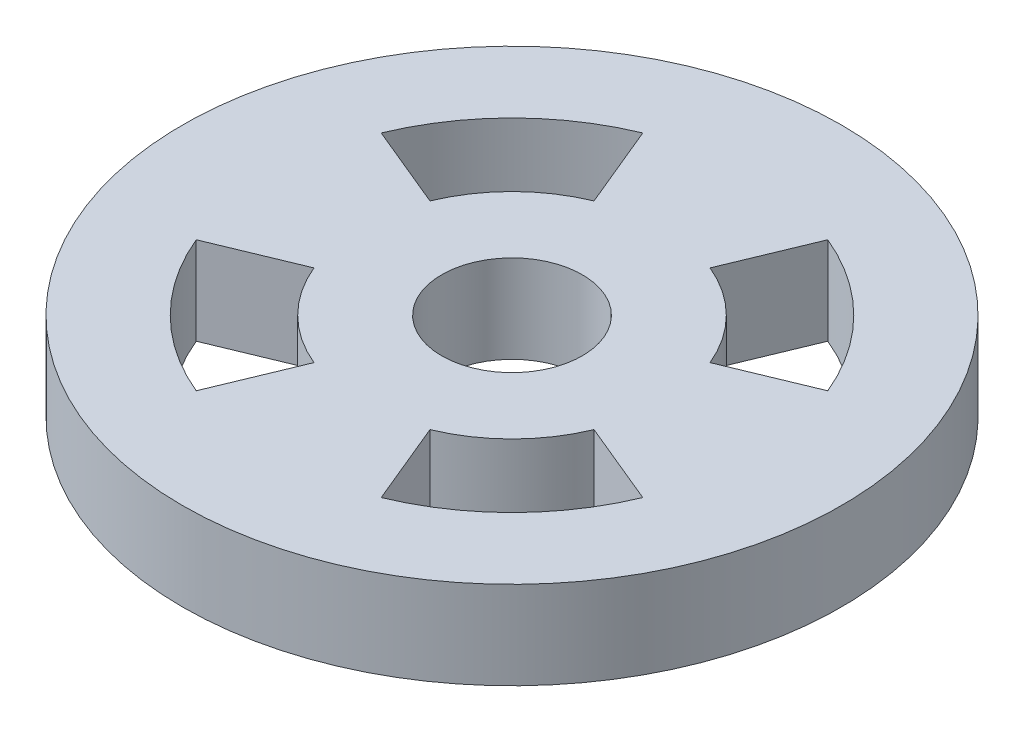
ISO-10303-21;
HEADER;
FILE_DESCRIPTION(('STEP AP214'),'2;1');
FILE_NAME('part.step','',(''),(''),'','','');
FILE_SCHEMA(('AUTOMOTIVE_DESIGN { 1 0 10303 214 1 1 1 1 }'));
ENDSEC;
DATA;
#1=APPLICATION_CONTEXT('core data for automotive mechanical design processes');
#2=APPLICATION_PROTOCOL_DEFINITION('international standard','automotive_design',2000,#1);
#3=PRODUCT_CONTEXT('',#1,'mechanical');
#4=PRODUCT('Part','Part','',(#3));
#5=PRODUCT_RELATED_PRODUCT_CATEGORY('part','',(#4));
#6=PRODUCT_DEFINITION_FORMATION('','',#4);
#7=PRODUCT_DEFINITION_CONTEXT('part definition',#1,'design');
#8=PRODUCT_DEFINITION('design','',#6,#7);
#9=PRODUCT_DEFINITION_SHAPE('','',#8);
#10=(LENGTH_UNIT() NAMED_UNIT(*) SI_UNIT(.MILLI.,.METRE.));
#11=(NAMED_UNIT(*) PLANE_ANGLE_UNIT() SI_UNIT($,.RADIAN.));
#12=(NAMED_UNIT(*) SI_UNIT($,.STERADIAN.) SOLID_ANGLE_UNIT());
#13=UNCERTAINTY_MEASURE_WITH_UNIT(LENGTH_MEASURE(1.E-05),#10,'distance_accuracy_value','');
#14=(GEOMETRIC_REPRESENTATION_CONTEXT(3) GLOBAL_UNCERTAINTY_ASSIGNED_CONTEXT((#13)) GLOBAL_UNIT_ASSIGNED_CONTEXT((#10,
#11,#12)) REPRESENTATION_CONTEXT('',''));
#15=CARTESIAN_POINT('',(0.,0.,0.));
#16=DIRECTION('',(0.,0.,1.));
#17=DIRECTION('',(1.,0.,0.));
#18=AXIS2_PLACEMENT_3D('',#15,#16,#17);
#19=CARTESIAN_POINT('',(0.,2.,0.));
#20=DIRECTION('',(0.,1.,0.));
#21=DIRECTION('',(0.,0.,1.));
#22=AXIS2_PLACEMENT_3D('',#19,#20,#21);
#23=PLANE('',#22);
#24=CARTESIAN_POINT('',(0.,2.,0.));
#25=DIRECTION('',(0.,1.,0.));
#26=DIRECTION('',(0.,0.,1.));
#27=AXIS2_PLACEMENT_3D('',#24,#25,#26);
#28=CIRCLE('',#27,7.5);
#29=CARTESIAN_POINT('',(0.,2.,7.5));
#30=VERTEX_POINT('',#29);
#31=EDGE_CURVE('E11',#30,#30,#28,.T.);
#32=ORIENTED_EDGE('',*,*,#31,.T.);
#33=EDGE_LOOP('',(#32));
#34=FACE_BOUND('',#33,.T.);
#35=CARTESIAN_POINT('',(0.,2.,0.));
#36=DIRECTION('',(0.,1.,0.));
#37=DIRECTION('',(0.,0.,1.));
#38=AXIS2_PLACEMENT_3D('',#35,#36,#37);
#39=CIRCLE('',#38,1.6);
#40=CARTESIAN_POINT('',(0.,2.,1.6));
#41=VERTEX_POINT('',#40);
#42=EDGE_CURVE('E275',#41,#41,#39,.T.);
#43=ORIENTED_EDGE('',*,*,#42,.F.);
#44=EDGE_LOOP('',(#43));
#45=FACE_BOUND('',#44,.T.);
#46=DIRECTION('',(0.923879532511286,0.,0.382683432365091));
#47=VECTOR('',#46,1.);
#48=CARTESIAN_POINT('',(-3.18654053840399,2.,-1.3199083080586));
#49=LINE('',#48,#47);
#50=CARTESIAN_POINT('',(-5.08133742881208,2.,-2.10475887800799));
#51=VERTEX_POINT('',#50);
#52=CARTESIAN_POINT('',(-3.18654053840399,2.,-1.3199083080586));
#53=VERTEX_POINT('',#52);
#54=EDGE_CURVE('E246',#51,#53,#49,.T.);
#55=ORIENTED_EDGE('',*,*,#54,.F.);
#56=CARTESIAN_POINT('',(0.,2.,0.));
#57=DIRECTION('',(0.,1.,0.));
#58=DIRECTION('',(0.,0.,1.));
#59=AXIS2_PLACEMENT_3D('',#56,#57,#58);
#60=CIRCLE('',#59,5.5);
#61=CARTESIAN_POINT('',(-2.104758878008,2.,-5.08133742881208));
#62=VERTEX_POINT('',#61);
#63=EDGE_CURVE('E244',#62,#51,#60,.T.);
#64=ORIENTED_EDGE('',*,*,#63,.F.);
#65=DIRECTION('',(-0.38268343236509,0.,-0.923879532511287));
#66=VECTOR('',#65,1.);
#67=CARTESIAN_POINT('',(-1.3199083080586,2.,-3.18654053840399));
#68=LINE('',#67,#66);
#69=CARTESIAN_POINT('',(-1.3199083080586,2.,-3.18654053840399));
#70=VERTEX_POINT('',#69);
#71=EDGE_CURVE('E252',#70,#62,#68,.T.);
#72=ORIENTED_EDGE('',*,*,#71,.F.);
#73=CARTESIAN_POINT('',(0.,2.,0.));
#74=DIRECTION('',(0.,-1.,0.));
#75=DIRECTION('',(0.,0.,1.));
#76=AXIS2_PLACEMENT_3D('',#73,#74,#75);
#77=CIRCLE('',#76,3.44908662468401);
#78=EDGE_CURVE('E249',#53,#70,#77,.T.);
#79=ORIENTED_EDGE('',*,*,#78,.F.);
#80=EDGE_LOOP('',(#55,#64,#72,#79));
#81=FACE_BOUND('',#80,.T.);
#82=DIRECTION('',(-0.38268343236509,0.,0.923879532511287));
#83=VECTOR('',#82,1.);
#84=CARTESIAN_POINT('',(1.3199083080586,2.,-3.18654053840399));
#85=LINE('',#84,#83);
#86=CARTESIAN_POINT('',(2.104758878008,2.,-5.08133742881208));
#87=VERTEX_POINT('',#86);
#88=CARTESIAN_POINT('',(1.3199083080586,2.,-3.18654053840399));
#89=VERTEX_POINT('',#88);
#90=EDGE_CURVE('E215',#87,#89,#85,.T.);
#91=ORIENTED_EDGE('',*,*,#90,.F.);
#92=CARTESIAN_POINT('',(0.,2.,0.));
#93=DIRECTION('',(0.,1.,0.));
#94=DIRECTION('',(0.,0.,1.));
#95=AXIS2_PLACEMENT_3D('',#92,#93,#94);
#96=CIRCLE('',#95,5.5);
#97=CARTESIAN_POINT('',(5.08133742881208,2.,-2.104758878008));
#98=VERTEX_POINT('',#97);
#99=EDGE_CURVE('E213',#98,#87,#96,.T.);
#100=ORIENTED_EDGE('',*,*,#99,.F.);
#101=DIRECTION('',(0.923879532511287,0.,-0.38268343236509));
#102=VECTOR('',#101,1.);
#103=CARTESIAN_POINT('',(3.18654053840399,2.,-1.3199083080586));
#104=LINE('',#103,#102);
#105=CARTESIAN_POINT('',(3.18654053840399,2.,-1.3199083080586));
#106=VERTEX_POINT('',#105);
#107=EDGE_CURVE('E221',#106,#98,#104,.T.);
#108=ORIENTED_EDGE('',*,*,#107,.F.);
#109=CARTESIAN_POINT('',(0.,2.,0.));
#110=DIRECTION('',(0.,-1.,0.));
#111=DIRECTION('',(0.,0.,1.));
#112=AXIS2_PLACEMENT_3D('',#109,#110,#111);
#113=CIRCLE('',#112,3.44908662468401);
#114=EDGE_CURVE('E218',#89,#106,#113,.T.);
#115=ORIENTED_EDGE('',*,*,#114,.F.);
#116=EDGE_LOOP('',(#91,#100,#108,#115));
#117=FACE_BOUND('',#116,.T.);
#118=DIRECTION('',(-0.923879532511286,0.,-0.382683432365091));
#119=VECTOR('',#118,1.);
#120=CARTESIAN_POINT('',(3.18654053840399,2.,1.3199083080586));
#121=LINE('',#120,#119);
#122=CARTESIAN_POINT('',(5.08133742881208,2.,2.104758878008));
#123=VERTEX_POINT('',#122);
#124=CARTESIAN_POINT('',(3.18654053840399,2.,1.3199083080586));
#125=VERTEX_POINT('',#124);
#126=EDGE_CURVE('E184',#123,#125,#121,.T.);
#127=ORIENTED_EDGE('',*,*,#126,.F.);
#128=CARTESIAN_POINT('',(0.,2.,0.));
#129=DIRECTION('',(0.,1.,0.));
#130=DIRECTION('',(0.,0.,1.));
#131=AXIS2_PLACEMENT_3D('',#128,#129,#130);
#132=CIRCLE('',#131,5.5);
#133=CARTESIAN_POINT('',(2.104758878008,2.,5.08133742881208));
#134=VERTEX_POINT('',#133);
#135=EDGE_CURVE('E182',#134,#123,#132,.T.);
#136=ORIENTED_EDGE('',*,*,#135,.F.);
#137=DIRECTION('',(0.38268343236509,0.,0.923879532511287));
#138=VECTOR('',#137,1.);
#139=CARTESIAN_POINT('',(1.3199083080586,2.,3.18654053840399));
#140=LINE('',#139,#138);
#141=CARTESIAN_POINT('',(1.3199083080586,2.,3.18654053840399));
#142=VERTEX_POINT('',#141);
#143=EDGE_CURVE('E190',#142,#134,#140,.T.);
#144=ORIENTED_EDGE('',*,*,#143,.F.);
#145=CARTESIAN_POINT('',(0.,2.,0.));
#146=DIRECTION('',(0.,-1.,0.));
#147=DIRECTION('',(0.,0.,1.));
#148=AXIS2_PLACEMENT_3D('',#145,#146,#147);
#149=CIRCLE('',#148,3.44908662468401);
#150=EDGE_CURVE('E187',#125,#142,#149,.T.);
#151=ORIENTED_EDGE('',*,*,#150,.F.);
#152=EDGE_LOOP('',(#127,#136,#144,#151));
#153=FACE_BOUND('',#152,.T.);
#154=DIRECTION('',(0.382683432365091,0.,-0.923879532511286));
#155=VECTOR('',#154,1.);
#156=CARTESIAN_POINT('',(-1.3199083080586,2.,3.18654053840399));
#157=LINE('',#156,#155);
#158=CARTESIAN_POINT('',(-2.104758878008,2.,5.08133742881208));
#159=VERTEX_POINT('',#158);
#160=CARTESIAN_POINT('',(-1.3199083080586,2.,3.18654053840399));
#161=VERTEX_POINT('',#160);
#162=EDGE_CURVE('E154',#159,#161,#157,.T.);
#163=ORIENTED_EDGE('',*,*,#162,.F.);
#164=CARTESIAN_POINT('',(0.,2.,0.));
#165=DIRECTION('',(0.,1.,0.));
#166=DIRECTION('',(0.,0.,1.));
#167=AXIS2_PLACEMENT_3D('',#164,#165,#166);
#168=CIRCLE('',#167,5.5);
#169=CARTESIAN_POINT('',(-5.08133742881208,2.,2.104758878008));
#170=VERTEX_POINT('',#169);
#171=EDGE_CURVE('E146',#170,#159,#168,.T.);
#172=ORIENTED_EDGE('',*,*,#171,.F.);
#173=DIRECTION('',(-0.923879532511287,0.,0.38268343236509));
#174=VECTOR('',#173,1.);
#175=CARTESIAN_POINT('',(-3.18654053840399,2.,1.3199083080586));
#176=LINE('',#175,#174);
#177=CARTESIAN_POINT('',(-3.18654053840399,2.,1.3199083080586));
#178=VERTEX_POINT('',#177);
#179=EDGE_CURVE('E168',#178,#170,#176,.T.);
#180=ORIENTED_EDGE('',*,*,#179,.F.);
#181=CARTESIAN_POINT('',(0.,2.,0.));
#182=DIRECTION('',(0.,-1.,0.));
#183=DIRECTION('',(0.,0.,1.));
#184=AXIS2_PLACEMENT_3D('',#181,#182,#183);
#185=CIRCLE('',#184,3.44908662468401);
#186=EDGE_CURVE('E166',#161,#178,#185,.T.);
#187=ORIENTED_EDGE('',*,*,#186,.F.);
#188=EDGE_LOOP('',(#163,#172,#180,#187));
#189=FACE_BOUND('',#188,.T.);
#190=ADVANCED_FACE('F33',(#34,#45,#81,#117,#153,#189),#23,.T.);
#191=CARTESIAN_POINT('',(0.,0.,0.));
#192=DIRECTION('',(0.,1.,0.));
#193=DIRECTION('',(0.,0.,1.));
#194=AXIS2_PLACEMENT_3D('',#191,#192,#193);
#195=PLANE('',#194);
#196=CARTESIAN_POINT('',(0.,0.,0.));
#197=DIRECTION('',(0.,1.,0.));
#198=DIRECTION('',(0.,0.,1.));
#199=AXIS2_PLACEMENT_3D('',#196,#197,#198);
#200=CIRCLE('',#199,5.5);
#201=CARTESIAN_POINT('',(2.104758878008,0.,5.08133742881208));
#202=VERTEX_POINT('',#201);
#203=CARTESIAN_POINT('',(5.08133742881208,0.,2.104758878008));
#204=VERTEX_POINT('',#203);
#205=EDGE_CURVE('E162',#202,#204,#200,.T.);
#206=ORIENTED_EDGE('',*,*,#205,.T.);
#207=DIRECTION('',(-0.923879532511286,0.,-0.382683432365091));
#208=VECTOR('',#207,1.);
#209=CARTESIAN_POINT('',(3.18654053840399,0.,1.3199083080586));
#210=LINE('',#209,#208);
#211=CARTESIAN_POINT('',(3.18654053840399,0.,1.3199083080586));
#212=VERTEX_POINT('',#211);
#213=EDGE_CURVE('E195',#204,#212,#210,.T.);
#214=ORIENTED_EDGE('',*,*,#213,.T.);
#215=CARTESIAN_POINT('',(0.,0.,0.));
#216=DIRECTION('',(0.,-1.,0.));
#217=DIRECTION('',(0.,0.,1.));
#218=AXIS2_PLACEMENT_3D('',#215,#216,#217);
#219=CIRCLE('',#218,3.44908662468401);
#220=CARTESIAN_POINT('',(1.3199083080586,0.,3.18654053840399));
#221=VERTEX_POINT('',#220);
#222=EDGE_CURVE('E198',#212,#221,#219,.T.);
#223=ORIENTED_EDGE('',*,*,#222,.T.);
#224=DIRECTION('',(0.38268343236509,0.,0.923879532511287));
#225=VECTOR('',#224,1.);
#226=CARTESIAN_POINT('',(1.3199083080586,0.,3.18654053840399));
#227=LINE('',#226,#225);
#228=EDGE_CURVE('E185',#221,#202,#227,.T.);
#229=ORIENTED_EDGE('',*,*,#228,.T.);
#230=EDGE_LOOP('',(#206,#214,#223,#229));
#231=FACE_BOUND('',#230,.T.);
#232=CARTESIAN_POINT('',(0.,0.,0.));
#233=DIRECTION('',(0.,1.,0.));
#234=DIRECTION('',(0.,0.,1.));
#235=AXIS2_PLACEMENT_3D('',#232,#233,#234);
#236=CIRCLE('',#235,5.5);
#237=CARTESIAN_POINT('',(-2.104758878008,0.,-5.08133742881208));
#238=VERTEX_POINT('',#237);
#239=CARTESIAN_POINT('',(-5.08133742881208,0.,-2.10475887800799));
#240=VERTEX_POINT('',#239);
#241=EDGE_CURVE('E243',#238,#240,#236,.T.);
#242=ORIENTED_EDGE('',*,*,#241,.T.);
#243=DIRECTION('',(0.923879532511286,0.,0.382683432365091));
#244=VECTOR('',#243,1.);
#245=CARTESIAN_POINT('',(-3.18654053840399,0.,-1.3199083080586));
#246=LINE('',#245,#244);
#247=CARTESIAN_POINT('',(-3.18654053840399,0.,-1.3199083080586));
#248=VERTEX_POINT('',#247);
#249=EDGE_CURVE('E257',#240,#248,#246,.T.);
#250=ORIENTED_EDGE('',*,*,#249,.T.);
#251=CARTESIAN_POINT('',(0.,0.,0.));
#252=DIRECTION('',(0.,-1.,0.));
#253=DIRECTION('',(0.,0.,1.));
#254=AXIS2_PLACEMENT_3D('',#251,#252,#253);
#255=CIRCLE('',#254,3.44908662468401);
#256=CARTESIAN_POINT('',(-1.3199083080586,0.,-3.18654053840399));
#257=VERTEX_POINT('',#256);
#258=EDGE_CURVE('E260',#248,#257,#255,.T.);
#259=ORIENTED_EDGE('',*,*,#258,.T.);
#260=DIRECTION('',(-0.38268343236509,0.,-0.923879532511287));
#261=VECTOR('',#260,1.);
#262=CARTESIAN_POINT('',(-1.3199083080586,0.,-3.18654053840399));
#263=LINE('',#262,#261);
#264=EDGE_CURVE('E247',#257,#238,#263,.T.);
#265=ORIENTED_EDGE('',*,*,#264,.T.);
#266=EDGE_LOOP('',(#242,#250,#259,#265));
#267=FACE_BOUND('',#266,.T.);
#268=CARTESIAN_POINT('',(0.,0.,0.));
#269=DIRECTION('',(0.,1.,0.));
#270=DIRECTION('',(0.,0.,1.));
#271=AXIS2_PLACEMENT_3D('',#268,#269,#270);
#272=CIRCLE('',#271,7.5);
#273=CARTESIAN_POINT('',(0.,0.,7.5));
#274=VERTEX_POINT('',#273);
#275=EDGE_CURVE('E37',#274,#274,#272,.T.);
#276=ORIENTED_EDGE('',*,*,#275,.F.);
#277=EDGE_LOOP('',(#276));
#278=FACE_BOUND('',#277,.T.);
#279=CARTESIAN_POINT('',(0.,0.,0.));
#280=DIRECTION('',(0.,1.,0.));
#281=DIRECTION('',(0.,0.,1.));
#282=AXIS2_PLACEMENT_3D('',#279,#280,#281);
#283=CIRCLE('',#282,1.6);
#284=CARTESIAN_POINT('',(0.,0.,1.6));
#285=VERTEX_POINT('',#284);
#286=EDGE_CURVE('E274',#285,#285,#283,.T.);
#287=ORIENTED_EDGE('',*,*,#286,.T.);
#288=EDGE_LOOP('',(#287));
#289=FACE_BOUND('',#288,.T.);
#290=CARTESIAN_POINT('',(0.,0.,0.));
#291=DIRECTION('',(0.,1.,0.));
#292=DIRECTION('',(0.,0.,1.));
#293=AXIS2_PLACEMENT_3D('',#290,#291,#292);
#294=CIRCLE('',#293,5.5);
#295=CARTESIAN_POINT('',(5.08133742881207,0.,-2.104758878008));
#296=VERTEX_POINT('',#295);
#297=CARTESIAN_POINT('',(2.104758878008,0.,-5.08133742881208));
#298=VERTEX_POINT('',#297);
#299=EDGE_CURVE('E212',#296,#298,#294,.T.);
#300=ORIENTED_EDGE('',*,*,#299,.T.);
#301=DIRECTION('',(-0.38268343236509,0.,0.923879532511287));
#302=VECTOR('',#301,1.);
#303=CARTESIAN_POINT('',(1.3199083080586,0.,-3.18654053840399));
#304=LINE('',#303,#302);
#305=CARTESIAN_POINT('',(1.3199083080586,0.,-3.18654053840399));
#306=VERTEX_POINT('',#305);
#307=EDGE_CURVE('E226',#298,#306,#304,.T.);
#308=ORIENTED_EDGE('',*,*,#307,.T.);
#309=CARTESIAN_POINT('',(0.,0.,0.));
#310=DIRECTION('',(0.,-1.,0.));
#311=DIRECTION('',(0.,0.,1.));
#312=AXIS2_PLACEMENT_3D('',#309,#310,#311);
#313=CIRCLE('',#312,3.44908662468401);
#314=CARTESIAN_POINT('',(3.18654053840399,0.,-1.3199083080586));
#315=VERTEX_POINT('',#314);
#316=EDGE_CURVE('E229',#306,#315,#313,.T.);
#317=ORIENTED_EDGE('',*,*,#316,.T.);
#318=DIRECTION('',(0.923879532511287,0.,-0.38268343236509));
#319=VECTOR('',#318,1.);
#320=CARTESIAN_POINT('',(3.18654053840399,0.,-1.3199083080586));
#321=LINE('',#320,#319);
#322=EDGE_CURVE('E216',#315,#296,#321,.T.);
#323=ORIENTED_EDGE('',*,*,#322,.T.);
#324=EDGE_LOOP('',(#300,#308,#317,#323));
#325=FACE_BOUND('',#324,.T.);
#326=CARTESIAN_POINT('',(0.,0.,0.));
#327=DIRECTION('',(0.,1.,0.));
#328=DIRECTION('',(0.,0.,1.));
#329=AXIS2_PLACEMENT_3D('',#326,#327,#328);
#330=CIRCLE('',#329,5.5);
#331=CARTESIAN_POINT('',(-5.08133742881207,0.,2.104758878008));
#332=VERTEX_POINT('',#331);
#333=CARTESIAN_POINT('',(-2.104758878008,0.,5.08133742881208));
#334=VERTEX_POINT('',#333);
#335=EDGE_CURVE('E56',#332,#334,#330,.T.);
#336=ORIENTED_EDGE('',*,*,#335,.T.);
#337=DIRECTION('',(0.382683432365091,0.,-0.923879532511286));
#338=VECTOR('',#337,1.);
#339=CARTESIAN_POINT('',(-1.3199083080586,0.,3.18654053840399));
#340=LINE('',#339,#338);
#341=CARTESIAN_POINT('',(-1.3199083080586,0.,3.18654053840399));
#342=VERTEX_POINT('',#341);
#343=EDGE_CURVE('E161',#334,#342,#340,.T.);
#344=ORIENTED_EDGE('',*,*,#343,.T.);
#345=CARTESIAN_POINT('',(0.,0.,0.));
#346=DIRECTION('',(0.,-1.,0.));
#347=DIRECTION('',(0.,0.,1.));
#348=AXIS2_PLACEMENT_3D('',#345,#346,#347);
#349=CIRCLE('',#348,3.44908662468401);
#350=CARTESIAN_POINT('',(-3.18654053840399,0.,1.3199083080586));
#351=VERTEX_POINT('',#350);
#352=EDGE_CURVE('E174',#342,#351,#349,.T.);
#353=ORIENTED_EDGE('',*,*,#352,.T.);
#354=DIRECTION('',(-0.923879532511287,0.,0.38268343236509));
#355=VECTOR('',#354,1.);
#356=CARTESIAN_POINT('',(-3.18654053840399,0.,1.3199083080586));
#357=LINE('',#356,#355);
#358=EDGE_CURVE('E155',#351,#332,#357,.T.);
#359=ORIENTED_EDGE('',*,*,#358,.T.);
#360=EDGE_LOOP('',(#336,#344,#353,#359));
#361=FACE_BOUND('',#360,.T.);
#362=ADVANCED_FACE('F281',(#231,#267,#278,#289,#325,#361),#195,.F.);
#363=CARTESIAN_POINT('',(0.,2.,0.));
#364=DIRECTION('',(0.,-1.,0.));
#365=DIRECTION('',(0.,0.,-1.));
#366=AXIS2_PLACEMENT_3D('',#363,#364,#365);
#367=CYLINDRICAL_SURFACE('',#366,7.5);
#368=ORIENTED_EDGE('',*,*,#31,.F.);
#369=EDGE_LOOP('',(#368));
#370=FACE_BOUND('',#369,.T.);
#371=ORIENTED_EDGE('',*,*,#275,.T.);
#372=EDGE_LOOP('',(#371));
#373=FACE_BOUND('',#372,.T.);
#374=ADVANCED_FACE('F35',(#370,#373),#367,.T.);
#375=CARTESIAN_POINT('',(0.,2.,0.));
#376=DIRECTION('',(0.,-1.,0.));
#377=DIRECTION('',(0.,0.,-1.));
#378=AXIS2_PLACEMENT_3D('',#375,#376,#377);
#379=CYLINDRICAL_SURFACE('',#378,1.6);
#380=ORIENTED_EDGE('',*,*,#42,.T.);
#381=EDGE_LOOP('',(#380));
#382=FACE_BOUND('',#381,.T.);
#383=ORIENTED_EDGE('',*,*,#286,.F.);
#384=EDGE_LOOP('',(#383));
#385=FACE_BOUND('',#384,.T.);
#386=ADVANCED_FACE('F284',(#382,#385),#379,.F.);
#387=CARTESIAN_POINT('',(0.,2.,0.));
#388=DIRECTION('',(0.,-1.,0.));
#389=DIRECTION('',(0.,0.,-1.));
#390=AXIS2_PLACEMENT_3D('',#387,#388,#389);
#391=CYLINDRICAL_SURFACE('',#390,5.5);
#392=ORIENTED_EDGE('',*,*,#241,.F.);
#393=DIRECTION('',(0.,-1.,0.));
#394=VECTOR('',#393,1.);
#395=CARTESIAN_POINT('',(-2.104758878008,2.,-5.08133742881208));
#396=LINE('',#395,#394);
#397=EDGE_CURVE('E254',#62,#238,#396,.T.);
#398=ORIENTED_EDGE('',*,*,#397,.F.);
#399=ORIENTED_EDGE('',*,*,#63,.T.);
#400=DIRECTION('',(0.,-1.,0.));
#401=VECTOR('',#400,1.);
#402=CARTESIAN_POINT('',(-5.08133742881208,2.,-2.10475887800799));
#403=LINE('',#402,#401);
#404=EDGE_CURVE('E271',#51,#240,#403,.T.);
#405=ORIENTED_EDGE('',*,*,#404,.T.);
#406=EDGE_LOOP('',(#392,#398,#399,#405));
#407=FACE_BOUND('',#406,.T.);
#408=ADVANCED_FACE('F286',(#407),#391,.F.);
#409=CARTESIAN_POINT('',(-3.18654053840399,2.,-1.3199083080586));
#410=DIRECTION('',(0.382683432365091,0.,-0.923879532511286));
#411=DIRECTION('',(-0.923879532511286,0.,-0.382683432365091));
#412=AXIS2_PLACEMENT_3D('',#409,#410,#411);
#413=PLANE('',#412);
#414=ORIENTED_EDGE('',*,*,#249,.F.);
#415=ORIENTED_EDGE('',*,*,#404,.F.);
#416=ORIENTED_EDGE('',*,*,#54,.T.);
#417=DIRECTION('',(0.,-1.,0.));
#418=VECTOR('',#417,1.);
#419=CARTESIAN_POINT('',(-3.18654053840399,2.,-1.3199083080586));
#420=LINE('',#419,#418);
#421=EDGE_CURVE('E269',#53,#248,#420,.T.);
#422=ORIENTED_EDGE('',*,*,#421,.T.);
#423=EDGE_LOOP('',(#414,#415,#416,#422));
#424=FACE_BOUND('',#423,.T.);
#425=ADVANCED_FACE('F293',(#424),#413,.T.);
#426=CARTESIAN_POINT('',(0.,2.,0.));
#427=DIRECTION('',(0.,-1.,0.));
#428=DIRECTION('',(0.,0.,-1.));
#429=AXIS2_PLACEMENT_3D('',#426,#427,#428);
#430=CYLINDRICAL_SURFACE('',#429,3.44908662468401);
#431=ORIENTED_EDGE('',*,*,#258,.F.);
#432=ORIENTED_EDGE('',*,*,#421,.F.);
#433=ORIENTED_EDGE('',*,*,#78,.T.);
#434=DIRECTION('',(0.,-1.,0.));
#435=VECTOR('',#434,1.);
#436=CARTESIAN_POINT('',(-1.3199083080586,2.,-3.18654053840399));
#437=LINE('',#436,#435);
#438=EDGE_CURVE('E267',#70,#257,#437,.T.);
#439=ORIENTED_EDGE('',*,*,#438,.T.);
#440=EDGE_LOOP('',(#431,#432,#433,#439));
#441=FACE_BOUND('',#440,.T.);
#442=ADVANCED_FACE('F367',(#441),#430,.T.);
#443=CARTESIAN_POINT('',(-1.3199083080586,2.,-3.18654053840399));
#444=DIRECTION('',(-0.923879532511287,0.,0.38268343236509));
#445=DIRECTION('',(0.38268343236509,0.,0.923879532511287));
#446=AXIS2_PLACEMENT_3D('',#443,#444,#445);
#447=PLANE('',#446);
#448=ORIENTED_EDGE('',*,*,#264,.F.);
#449=ORIENTED_EDGE('',*,*,#438,.F.);
#450=ORIENTED_EDGE('',*,*,#71,.T.);
#451=ORIENTED_EDGE('',*,*,#397,.T.);
#452=EDGE_LOOP('',(#448,#449,#450,#451));
#453=FACE_BOUND('',#452,.T.);
#454=ADVANCED_FACE('F363',(#453),#447,.T.);
#455=CARTESIAN_POINT('',(0.,2.,0.));
#456=DIRECTION('',(0.,-1.,0.));
#457=DIRECTION('',(0.,0.,-1.));
#458=AXIS2_PLACEMENT_3D('',#455,#456,#457);
#459=CYLINDRICAL_SURFACE('',#458,5.5);
#460=ORIENTED_EDGE('',*,*,#299,.F.);
#461=DIRECTION('',(0.,-1.,0.));
#462=VECTOR('',#461,1.);
#463=CARTESIAN_POINT('',(5.08133742881208,2.,-2.104758878008));
#464=LINE('',#463,#462);
#465=EDGE_CURVE('E223',#98,#296,#464,.T.);
#466=ORIENTED_EDGE('',*,*,#465,.F.);
#467=ORIENTED_EDGE('',*,*,#99,.T.);
#468=DIRECTION('',(0.,-1.,0.));
#469=VECTOR('',#468,1.);
#470=CARTESIAN_POINT('',(2.104758878008,2.,-5.08133742881208));
#471=LINE('',#470,#469);
#472=EDGE_CURVE('E240',#87,#298,#471,.T.);
#473=ORIENTED_EDGE('',*,*,#472,.T.);
#474=EDGE_LOOP('',(#460,#466,#467,#473));
#475=FACE_BOUND('',#474,.T.);
#476=ADVANCED_FACE('F359',(#475),#459,.F.);
#477=CARTESIAN_POINT('',(1.3199083080586,2.,-3.18654053840399));
#478=DIRECTION('',(0.923879532511287,0.,0.38268343236509));
#479=DIRECTION('',(0.38268343236509,0.,-0.923879532511287));
#480=AXIS2_PLACEMENT_3D('',#477,#478,#479);
#481=PLANE('',#480);
#482=ORIENTED_EDGE('',*,*,#307,.F.);
#483=ORIENTED_EDGE('',*,*,#472,.F.);
#484=ORIENTED_EDGE('',*,*,#90,.T.);
#485=DIRECTION('',(0.,-1.,0.));
#486=VECTOR('',#485,1.);
#487=CARTESIAN_POINT('',(1.3199083080586,2.,-3.18654053840399));
#488=LINE('',#487,#486);
#489=EDGE_CURVE('E238',#89,#306,#488,.T.);
#490=ORIENTED_EDGE('',*,*,#489,.T.);
#491=EDGE_LOOP('',(#482,#483,#484,#490));
#492=FACE_BOUND('',#491,.T.);
#493=ADVANCED_FACE('F355',(#492),#481,.T.);
#494=CARTESIAN_POINT('',(0.,2.,0.));
#495=DIRECTION('',(0.,-1.,0.));
#496=DIRECTION('',(0.,0.,-1.));
#497=AXIS2_PLACEMENT_3D('',#494,#495,#496);
#498=CYLINDRICAL_SURFACE('',#497,3.44908662468401);
#499=ORIENTED_EDGE('',*,*,#316,.F.);
#500=ORIENTED_EDGE('',*,*,#489,.F.);
#501=ORIENTED_EDGE('',*,*,#114,.T.);
#502=DIRECTION('',(0.,-1.,0.));
#503=VECTOR('',#502,1.);
#504=CARTESIAN_POINT('',(3.18654053840399,2.,-1.3199083080586));
#505=LINE('',#504,#503);
#506=EDGE_CURVE('E236',#106,#315,#505,.T.);
#507=ORIENTED_EDGE('',*,*,#506,.T.);
#508=EDGE_LOOP('',(#499,#500,#501,#507));
#509=FACE_BOUND('',#508,.T.);
#510=ADVANCED_FACE('F351',(#509),#498,.T.);
#511=CARTESIAN_POINT('',(3.18654053840399,2.,-1.3199083080586));
#512=DIRECTION('',(-0.38268343236509,0.,-0.923879532511287));
#513=DIRECTION('',(-0.923879532511287,0.,0.38268343236509));
#514=AXIS2_PLACEMENT_3D('',#511,#512,#513);
#515=PLANE('',#514);
#516=ORIENTED_EDGE('',*,*,#322,.F.);
#517=ORIENTED_EDGE('',*,*,#506,.F.);
#518=ORIENTED_EDGE('',*,*,#107,.T.);
#519=ORIENTED_EDGE('',*,*,#465,.T.);
#520=EDGE_LOOP('',(#516,#517,#518,#519));
#521=FACE_BOUND('',#520,.T.);
#522=ADVANCED_FACE('F348',(#521),#515,.T.);
#523=CARTESIAN_POINT('',(0.,2.,0.));
#524=DIRECTION('',(0.,-1.,0.));
#525=DIRECTION('',(0.,0.,-1.));
#526=AXIS2_PLACEMENT_3D('',#523,#524,#525);
#527=CYLINDRICAL_SURFACE('',#526,5.5);
#528=ORIENTED_EDGE('',*,*,#205,.F.);
#529=DIRECTION('',(0.,-1.,0.));
#530=VECTOR('',#529,1.);
#531=CARTESIAN_POINT('',(2.104758878008,2.,5.08133742881208));
#532=LINE('',#531,#530);
#533=EDGE_CURVE('E192',#134,#202,#532,.T.);
#534=ORIENTED_EDGE('',*,*,#533,.F.);
#535=ORIENTED_EDGE('',*,*,#135,.T.);
#536=DIRECTION('',(0.,-1.,0.));
#537=VECTOR('',#536,1.);
#538=CARTESIAN_POINT('',(5.08133742881208,2.,2.104758878008));
#539=LINE('',#538,#537);
#540=EDGE_CURVE('E209',#123,#204,#539,.T.);
#541=ORIENTED_EDGE('',*,*,#540,.T.);
#542=EDGE_LOOP('',(#528,#534,#535,#541));
#543=FACE_BOUND('',#542,.T.);
#544=ADVANCED_FACE('F330',(#543),#527,.F.);
#545=CARTESIAN_POINT('',(3.18654053840399,2.,1.3199083080586));
#546=DIRECTION('',(-0.382683432365091,0.,0.923879532511286));
#547=DIRECTION('',(0.923879532511286,0.,0.382683432365091));
#548=AXIS2_PLACEMENT_3D('',#545,#546,#547);
#549=PLANE('',#548);
#550=ORIENTED_EDGE('',*,*,#213,.F.);
#551=ORIENTED_EDGE('',*,*,#540,.F.);
#552=ORIENTED_EDGE('',*,*,#126,.T.);
#553=DIRECTION('',(0.,-1.,0.));
#554=VECTOR('',#553,1.);
#555=CARTESIAN_POINT('',(3.18654053840399,2.,1.3199083080586));
#556=LINE('',#555,#554);
#557=EDGE_CURVE('E207',#125,#212,#556,.T.);
#558=ORIENTED_EDGE('',*,*,#557,.T.);
#559=EDGE_LOOP('',(#550,#551,#552,#558));
#560=FACE_BOUND('',#559,.T.);
#561=ADVANCED_FACE('F323',(#560),#549,.T.);
#562=CARTESIAN_POINT('',(0.,2.,0.));
#563=DIRECTION('',(0.,-1.,0.));
#564=DIRECTION('',(0.,0.,-1.));
#565=AXIS2_PLACEMENT_3D('',#562,#563,#564);
#566=CYLINDRICAL_SURFACE('',#565,3.44908662468401);
#567=ORIENTED_EDGE('',*,*,#222,.F.);
#568=ORIENTED_EDGE('',*,*,#557,.F.);
#569=ORIENTED_EDGE('',*,*,#150,.T.);
#570=DIRECTION('',(0.,-1.,0.));
#571=VECTOR('',#570,1.);
#572=CARTESIAN_POINT('',(1.3199083080586,2.,3.18654053840399));
#573=LINE('',#572,#571);
#574=EDGE_CURVE('E205',#142,#221,#573,.T.);
#575=ORIENTED_EDGE('',*,*,#574,.T.);
#576=EDGE_LOOP('',(#567,#568,#569,#575));
#577=FACE_BOUND('',#576,.T.);
#578=ADVANCED_FACE('F326',(#577),#566,.T.);
#579=CARTESIAN_POINT('',(1.3199083080586,2.,3.18654053840399));
#580=DIRECTION('',(0.923879532511287,0.,-0.38268343236509));
#581=DIRECTION('',(-0.38268343236509,0.,-0.923879532511287));
#582=AXIS2_PLACEMENT_3D('',#579,#580,#581);
#583=PLANE('',#582);
#584=ORIENTED_EDGE('',*,*,#228,.F.);
#585=ORIENTED_EDGE('',*,*,#574,.F.);
#586=ORIENTED_EDGE('',*,*,#143,.T.);
#587=ORIENTED_EDGE('',*,*,#533,.T.);
#588=EDGE_LOOP('',(#584,#585,#586,#587));
#589=FACE_BOUND('',#588,.T.);
#590=ADVANCED_FACE('F333',(#589),#583,.T.);
#591=CARTESIAN_POINT('',(0.,2.,0.));
#592=DIRECTION('',(0.,-1.,0.));
#593=DIRECTION('',(0.,0.,-1.));
#594=AXIS2_PLACEMENT_3D('',#591,#592,#593);
#595=CYLINDRICAL_SURFACE('',#594,5.5);
#596=ORIENTED_EDGE('',*,*,#335,.F.);
#597=DIRECTION('',(0.,-1.,0.));
#598=VECTOR('',#597,1.);
#599=CARTESIAN_POINT('',(-5.08133742881208,2.,2.104758878008));
#600=LINE('',#599,#598);
#601=EDGE_CURVE('E150',#170,#332,#600,.T.);
#602=ORIENTED_EDGE('',*,*,#601,.F.);
#603=ORIENTED_EDGE('',*,*,#171,.T.);
#604=DIRECTION('',(0.,-1.,0.));
#605=VECTOR('',#604,1.);
#606=CARTESIAN_POINT('',(-2.104758878008,2.,5.08133742881208));
#607=LINE('',#606,#605);
#608=EDGE_CURVE('E149',#159,#334,#607,.T.);
#609=ORIENTED_EDGE('',*,*,#608,.T.);
#610=EDGE_LOOP('',(#596,#602,#603,#609));
#611=FACE_BOUND('',#610,.T.);
#612=ADVANCED_FACE('F148',(#611),#595,.F.);
#613=CARTESIAN_POINT('',(-1.3199083080586,2.,3.18654053840399));
#614=DIRECTION('',(-0.923879532511286,0.,-0.382683432365091));
#615=DIRECTION('',(-0.382683432365091,0.,0.923879532511286));
#616=AXIS2_PLACEMENT_3D('',#613,#614,#615);
#617=PLANE('',#616);
#618=ORIENTED_EDGE('',*,*,#343,.F.);
#619=ORIENTED_EDGE('',*,*,#608,.F.);
#620=ORIENTED_EDGE('',*,*,#162,.T.);
#621=DIRECTION('',(0.,-1.,0.));
#622=VECTOR('',#621,1.);
#623=CARTESIAN_POINT('',(-1.3199083080586,2.,3.18654053840399));
#624=LINE('',#623,#622);
#625=EDGE_CURVE('E163',#161,#342,#624,.T.);
#626=ORIENTED_EDGE('',*,*,#625,.T.);
#627=EDGE_LOOP('',(#618,#619,#620,#626));
#628=FACE_BOUND('',#627,.T.);
#629=ADVANCED_FACE('F158',(#628),#617,.T.);
#630=CARTESIAN_POINT('',(0.,2.,0.));
#631=DIRECTION('',(0.,-1.,0.));
#632=DIRECTION('',(0.,0.,-1.));
#633=AXIS2_PLACEMENT_3D('',#630,#631,#632);
#634=CYLINDRICAL_SURFACE('',#633,3.44908662468401);
#635=ORIENTED_EDGE('',*,*,#352,.F.);
#636=ORIENTED_EDGE('',*,*,#625,.F.);
#637=ORIENTED_EDGE('',*,*,#186,.T.);
#638=DIRECTION('',(0.,-1.,0.));
#639=VECTOR('',#638,1.);
#640=CARTESIAN_POINT('',(-3.18654053840399,2.,1.3199083080586));
#641=LINE('',#640,#639);
#642=EDGE_CURVE('E48',#178,#351,#641,.T.);
#643=ORIENTED_EDGE('',*,*,#642,.T.);
#644=EDGE_LOOP('',(#635,#636,#637,#643));
#645=FACE_BOUND('',#644,.T.);
#646=ADVANCED_FACE('F443',(#645),#634,.T.);
#647=CARTESIAN_POINT('',(-3.18654053840399,2.,1.3199083080586));
#648=DIRECTION('',(0.38268343236509,0.,0.923879532511287));
#649=DIRECTION('',(0.923879532511287,0.,-0.38268343236509));
#650=AXIS2_PLACEMENT_3D('',#647,#648,#649);
#651=PLANE('',#650);
#652=ORIENTED_EDGE('',*,*,#358,.F.);
#653=ORIENTED_EDGE('',*,*,#642,.F.);
#654=ORIENTED_EDGE('',*,*,#179,.T.);
#655=ORIENTED_EDGE('',*,*,#601,.T.);
#656=EDGE_LOOP('',(#652,#653,#654,#655));
#657=FACE_BOUND('',#656,.T.);
#658=ADVANCED_FACE('F451',(#657),#651,.T.);
#659=CLOSED_SHELL('',(#190,#362,#374,#386,#408,#425,#442,#454,#476,#493,#510,#522,#544,#561,
#578,#590,#612,#629,#646,#658));
#660=MANIFOLD_SOLID_BREP('B2',#659);
#661=ADVANCED_BREP_SHAPE_REPRESENTATION('',(#18,#660),#14);
#662=SHAPE_DEFINITION_REPRESENTATION(#9,#661);
ENDSEC;
END-ISO-10303-21;
